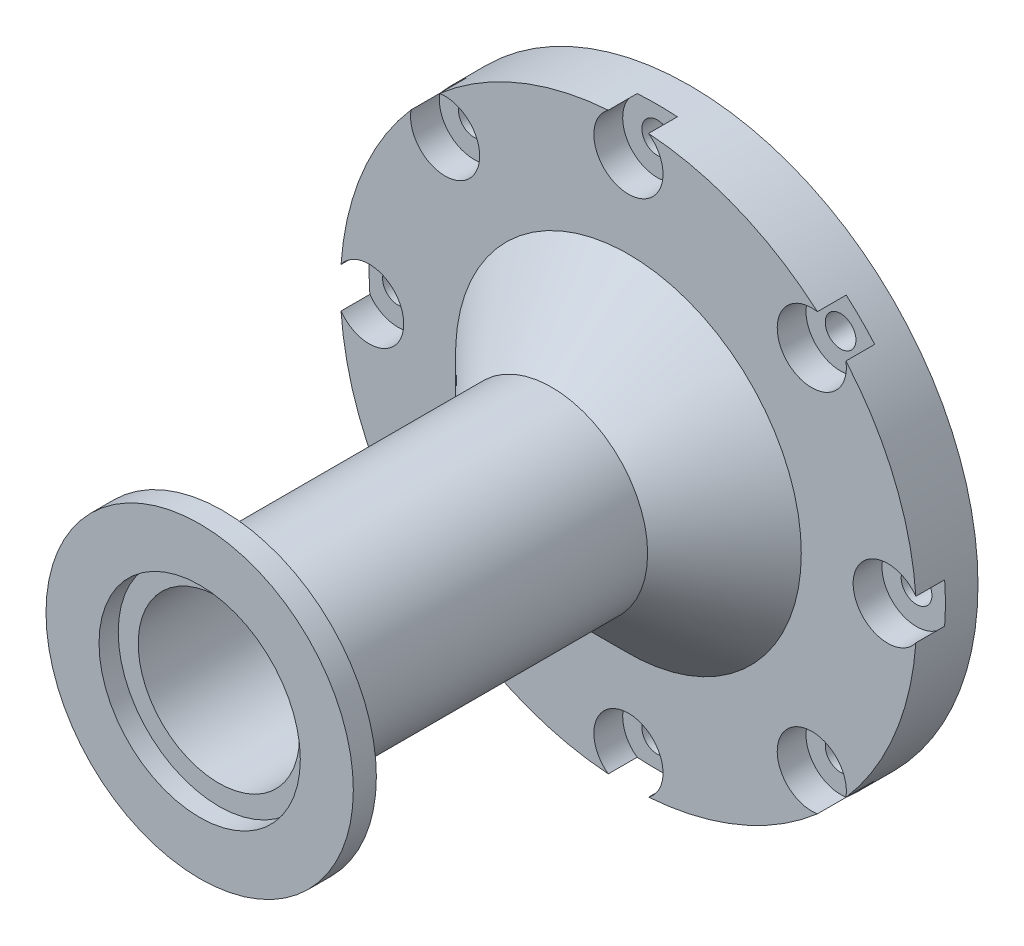
ISO-10303-21;
HEADER;
FILE_DESCRIPTION(('STEP AP214'),'2;1');
FILE_NAME('part.step','',(''),(''),'','','');
FILE_SCHEMA(('AUTOMOTIVE_DESIGN { 1 0 10303 214 1 1 1 1 }'));
ENDSEC;
DATA;
#1=APPLICATION_CONTEXT('core data for automotive mechanical design processes');
#2=APPLICATION_PROTOCOL_DEFINITION('international standard','automotive_design',2000,#1);
#3=PRODUCT_CONTEXT('',#1,'mechanical');
#4=PRODUCT('Part','Part','',(#3));
#5=PRODUCT_RELATED_PRODUCT_CATEGORY('part','',(#4));
#6=PRODUCT_DEFINITION_FORMATION('','',#4);
#7=PRODUCT_DEFINITION_CONTEXT('part definition',#1,'design');
#8=PRODUCT_DEFINITION('design','',#6,#7);
#9=PRODUCT_DEFINITION_SHAPE('','',#8);
#10=(LENGTH_UNIT() NAMED_UNIT(*) SI_UNIT(.MILLI.,.METRE.));
#11=(NAMED_UNIT(*) PLANE_ANGLE_UNIT() SI_UNIT($,.RADIAN.));
#12=(NAMED_UNIT(*) SI_UNIT($,.STERADIAN.) SOLID_ANGLE_UNIT());
#13=UNCERTAINTY_MEASURE_WITH_UNIT(LENGTH_MEASURE(1.E-05),#10,'distance_accuracy_value','');
#14=(GEOMETRIC_REPRESENTATION_CONTEXT(3) GLOBAL_UNCERTAINTY_ASSIGNED_CONTEXT((#13)) GLOBAL_UNIT_ASSIGNED_CONTEXT((#10,
#11,#12)) REPRESENTATION_CONTEXT('',''));
#15=CARTESIAN_POINT('',(0.,0.,0.));
#16=DIRECTION('',(0.,0.,1.));
#17=DIRECTION('',(1.,0.,0.));
#18=AXIS2_PLACEMENT_3D('',#15,#16,#17);
#19=CARTESIAN_POINT('',(-23.8648538650466,-23.8648538650456,7.99999999999999));
#20=DIRECTION('',(0.,0.,-1.));
#21=DIRECTION('',(-1.,0.,0.));
#22=AXIS2_PLACEMENT_3D('',#19,#20,#21);
#23=CYLINDRICAL_SURFACE('',#22,2.00000000000001);
#24=CARTESIAN_POINT('',(-23.8648538650466,-23.8648538650456,0.));
#25=DIRECTION('',(0.,0.,1.));
#26=DIRECTION('',(1.,0.,0.));
#27=AXIS2_PLACEMENT_3D('',#24,#25,#26);
#28=CIRCLE('',#27,2.00000000000001);
#29=CARTESIAN_POINT('',(-21.8648538650466,-23.8648538650456,0.));
#30=VERTEX_POINT('',#29);
#31=EDGE_CURVE('E993',#30,#30,#28,.T.);
#32=ORIENTED_EDGE('',*,*,#31,.F.);
#33=EDGE_LOOP('',(#32));
#34=FACE_BOUND('',#33,.T.);
#35=CARTESIAN_POINT('',(-23.8648538650466,-23.8648538650456,4.25));
#36=DIRECTION('',(0.,0.,1.));
#37=DIRECTION('',(1.,0.,0.));
#38=AXIS2_PLACEMENT_3D('',#35,#36,#37);
#39=CIRCLE('',#38,2.00000000000001);
#40=CARTESIAN_POINT('',(-21.8648538650466,-23.8648538650456,4.25));
#41=VERTEX_POINT('',#40);
#42=EDGE_CURVE('E871',#41,#41,#39,.T.);
#43=ORIENTED_EDGE('',*,*,#42,.T.);
#44=EDGE_LOOP('',(#43));
#45=FACE_BOUND('',#44,.T.);
#46=ADVANCED_FACE('F566',(#34,#45),#23,.F.);
#47=CARTESIAN_POINT('',(-7.23379689482329E-13,-33.7500000000001,7.99999999999999));
#48=DIRECTION('',(0.,0.,-1.));
#49=DIRECTION('',(-1.,0.,0.));
#50=AXIS2_PLACEMENT_3D('',#47,#48,#49);
#51=CYLINDRICAL_SURFACE('',#50,2.00000000000001);
#52=CARTESIAN_POINT('',(-7.23379689482329E-13,-33.7500000000001,0.));
#53=DIRECTION('',(0.,0.,1.));
#54=DIRECTION('',(1.,0.,0.));
#55=AXIS2_PLACEMENT_3D('',#52,#53,#54);
#56=CIRCLE('',#55,2.00000000000001);
#57=CARTESIAN_POINT('',(1.99999999999928,-33.7500000000001,0.));
#58=VERTEX_POINT('',#57);
#59=EDGE_CURVE('E989',#58,#58,#56,.T.);
#60=ORIENTED_EDGE('',*,*,#59,.F.);
#61=EDGE_LOOP('',(#60));
#62=FACE_BOUND('',#61,.T.);
#63=CARTESIAN_POINT('',(-7.23379689482329E-13,-33.7500000000001,4.24999999999999));
#64=DIRECTION('',(0.,0.,1.));
#65=DIRECTION('',(1.,0.,0.));
#66=AXIS2_PLACEMENT_3D('',#63,#64,#65);
#67=CIRCLE('',#66,2.00000000000001);
#68=CARTESIAN_POINT('',(1.99999999999928,-33.7500000000001,4.24999999999999));
#69=VERTEX_POINT('',#68);
#70=EDGE_CURVE('E859',#69,#69,#67,.T.);
#71=ORIENTED_EDGE('',*,*,#70,.T.);
#72=EDGE_LOOP('',(#71));
#73=FACE_BOUND('',#72,.T.);
#74=ADVANCED_FACE('F1045',(#62,#73),#51,.F.);
#75=CARTESIAN_POINT('',(23.8648538650455,-23.8648538650465,7.99999999999999));
#76=DIRECTION('',(0.,0.,-1.));
#77=DIRECTION('',(-1.,0.,0.));
#78=AXIS2_PLACEMENT_3D('',#75,#76,#77);
#79=CYLINDRICAL_SURFACE('',#78,2.);
#80=CARTESIAN_POINT('',(23.8648538650455,-23.8648538650465,0.));
#81=DIRECTION('',(0.,0.,1.));
#82=DIRECTION('',(1.,0.,0.));
#83=AXIS2_PLACEMENT_3D('',#80,#81,#82);
#84=CIRCLE('',#83,2.);
#85=CARTESIAN_POINT('',(25.8648538650455,-23.8648538650465,0.));
#86=VERTEX_POINT('',#85);
#87=EDGE_CURVE('E985',#86,#86,#84,.T.);
#88=ORIENTED_EDGE('',*,*,#87,.F.);
#89=EDGE_LOOP('',(#88));
#90=FACE_BOUND('',#89,.T.);
#91=CARTESIAN_POINT('',(23.8648538650455,-23.8648538650465,4.25));
#92=DIRECTION('',(0.,0.,1.));
#93=DIRECTION('',(1.,0.,0.));
#94=AXIS2_PLACEMENT_3D('',#91,#92,#93);
#95=CIRCLE('',#94,2.);
#96=CARTESIAN_POINT('',(25.8648538650455,-23.8648538650465,4.25));
#97=VERTEX_POINT('',#96);
#98=EDGE_CURVE('E845',#97,#97,#95,.T.);
#99=ORIENTED_EDGE('',*,*,#98,.T.);
#100=EDGE_LOOP('',(#99));
#101=FACE_BOUND('',#100,.T.);
#102=ADVANCED_FACE('F1050',(#90,#101),#79,.F.);
#103=CARTESIAN_POINT('',(33.75,0.,8.00000000000001));
#104=DIRECTION('',(0.,0.,-1.));
#105=DIRECTION('',(-1.,0.,0.));
#106=AXIS2_PLACEMENT_3D('',#103,#104,#105);
#107=CYLINDRICAL_SURFACE('',#106,2.);
#108=CARTESIAN_POINT('',(33.75,0.,0.));
#109=DIRECTION('',(0.,0.,1.));
#110=DIRECTION('',(1.,0.,0.));
#111=AXIS2_PLACEMENT_3D('',#108,#109,#110);
#112=CIRCLE('',#111,2.);
#113=CARTESIAN_POINT('',(35.75,0.,0.));
#114=VERTEX_POINT('',#113);
#115=EDGE_CURVE('E981',#114,#114,#112,.T.);
#116=ORIENTED_EDGE('',*,*,#115,.F.);
#117=EDGE_LOOP('',(#116));
#118=FACE_BOUND('',#117,.T.);
#119=CARTESIAN_POINT('',(33.75,0.,4.25));
#120=DIRECTION('',(0.,0.,1.));
#121=DIRECTION('',(1.,0.,0.));
#122=AXIS2_PLACEMENT_3D('',#119,#120,#121);
#123=CIRCLE('',#122,2.);
#124=CARTESIAN_POINT('',(35.75,0.,4.25));
#125=VERTEX_POINT('',#124);
#126=EDGE_CURVE('E831',#125,#125,#123,.T.);
#127=ORIENTED_EDGE('',*,*,#126,.T.);
#128=EDGE_LOOP('',(#127));
#129=FACE_BOUND('',#128,.T.);
#130=ADVANCED_FACE('F1091',(#118,#129),#107,.F.);
#131=CARTESIAN_POINT('',(23.8648538650463,23.8648538650457,8.00000000000001));
#132=DIRECTION('',(0.,0.,-1.));
#133=DIRECTION('',(-1.,0.,0.));
#134=AXIS2_PLACEMENT_3D('',#131,#132,#133);
#135=CYLINDRICAL_SURFACE('',#134,2.);
#136=CARTESIAN_POINT('',(23.8648538650463,23.8648538650457,0.));
#137=DIRECTION('',(0.,0.,1.));
#138=DIRECTION('',(1.,0.,0.));
#139=AXIS2_PLACEMENT_3D('',#136,#137,#138);
#140=CIRCLE('',#139,2.);
#141=CARTESIAN_POINT('',(25.8648538650463,23.8648538650457,0.));
#142=VERTEX_POINT('',#141);
#143=EDGE_CURVE('E974',#142,#142,#140,.T.);
#144=ORIENTED_EDGE('',*,*,#143,.F.);
#145=EDGE_LOOP('',(#144));
#146=FACE_BOUND('',#145,.T.);
#147=CARTESIAN_POINT('',(23.8648538650463,23.8648538650457,4.25));
#148=DIRECTION('',(0.,0.,1.));
#149=DIRECTION('',(1.,0.,0.));
#150=AXIS2_PLACEMENT_3D('',#147,#148,#149);
#151=CIRCLE('',#150,2.);
#152=CARTESIAN_POINT('',(25.8648538650463,23.8648538650457,4.25));
#153=VERTEX_POINT('',#152);
#154=EDGE_CURVE('E817',#153,#153,#151,.T.);
#155=ORIENTED_EDGE('',*,*,#154,.T.);
#156=EDGE_LOOP('',(#155));
#157=FACE_BOUND('',#156,.T.);
#158=ADVANCED_FACE('F1063',(#146,#157),#135,.F.);
#159=CARTESIAN_POINT('',(3.48471251854221E-13,33.75,8.00000000000001));
#160=DIRECTION('',(0.,0.,-1.));
#161=DIRECTION('',(-1.,0.,0.));
#162=AXIS2_PLACEMENT_3D('',#159,#160,#161);
#163=CYLINDRICAL_SURFACE('',#162,2.);
#164=CARTESIAN_POINT('',(3.48471251854221E-13,33.75,0.));
#165=DIRECTION('',(0.,0.,1.));
#166=DIRECTION('',(1.,0.,0.));
#167=AXIS2_PLACEMENT_3D('',#164,#165,#166);
#168=CIRCLE('',#167,2.);
#169=CARTESIAN_POINT('',(2.00000000000035,33.75,0.));
#170=VERTEX_POINT('',#169);
#171=EDGE_CURVE('E759',#170,#170,#168,.T.);
#172=ORIENTED_EDGE('',*,*,#171,.F.);
#173=EDGE_LOOP('',(#172));
#174=FACE_BOUND('',#173,.T.);
#175=CARTESIAN_POINT('',(3.48471251854221E-13,33.75,4.25));
#176=DIRECTION('',(0.,0.,1.));
#177=DIRECTION('',(1.,0.,0.));
#178=AXIS2_PLACEMENT_3D('',#175,#176,#177);
#179=CIRCLE('',#178,2.);
#180=CARTESIAN_POINT('',(2.00000000000035,33.75,4.25));
#181=VERTEX_POINT('',#180);
#182=EDGE_CURVE('E803',#181,#181,#179,.T.);
#183=ORIENTED_EDGE('',*,*,#182,.T.);
#184=EDGE_LOOP('',(#183));
#185=FACE_BOUND('',#184,.T.);
#186=ADVANCED_FACE('F1013',(#174,#185),#163,.F.);
#187=CARTESIAN_POINT('',(-23.8648538650459,23.8648538650462,8.00000000000001));
#188=DIRECTION('',(0.,0.,-1.));
#189=DIRECTION('',(-1.,0.,0.));
#190=AXIS2_PLACEMENT_3D('',#187,#188,#189);
#191=CYLINDRICAL_SURFACE('',#190,2.00000000000001);
#192=CARTESIAN_POINT('',(-23.8648538650459,23.8648538650462,0.));
#193=DIRECTION('',(0.,0.,1.));
#194=DIRECTION('',(1.,0.,0.));
#195=AXIS2_PLACEMENT_3D('',#192,#193,#194);
#196=CIRCLE('',#195,2.00000000000001);
#197=CARTESIAN_POINT('',(-21.8648538650459,23.8648538650462,0.));
#198=VERTEX_POINT('',#197);
#199=EDGE_CURVE('E764',#198,#198,#196,.T.);
#200=ORIENTED_EDGE('',*,*,#199,.F.);
#201=EDGE_LOOP('',(#200));
#202=FACE_BOUND('',#201,.T.);
#203=CARTESIAN_POINT('',(-23.8648538650459,23.8648538650462,4.25));
#204=DIRECTION('',(0.,0.,1.));
#205=DIRECTION('',(1.,0.,0.));
#206=AXIS2_PLACEMENT_3D('',#203,#204,#205);
#207=CIRCLE('',#206,2.00000000000001);
#208=CARTESIAN_POINT('',(-21.8648538650459,23.8648538650462,4.25));
#209=VERTEX_POINT('',#208);
#210=EDGE_CURVE('E789',#209,#209,#207,.T.);
#211=ORIENTED_EDGE('',*,*,#210,.T.);
#212=EDGE_LOOP('',(#211));
#213=FACE_BOUND('',#212,.T.);
#214=ADVANCED_FACE('F1009',(#202,#213),#191,.F.);
#215=CARTESIAN_POINT('',(-33.7500000000002,1.85615411929518E-13,8.00000000000001));
#216=DIRECTION('',(0.,0.,-1.));
#217=DIRECTION('',(-1.,0.,0.));
#218=AXIS2_PLACEMENT_3D('',#215,#216,#217);
#219=CYLINDRICAL_SURFACE('',#218,2.00000000000001);
#220=CARTESIAN_POINT('',(-33.7500000000002,1.85615411929518E-13,0.));
#221=DIRECTION('',(0.,0.,1.));
#222=DIRECTION('',(1.,0.,0.));
#223=AXIS2_PLACEMENT_3D('',#220,#221,#222);
#224=CIRCLE('',#223,2.00000000000001);
#225=CARTESIAN_POINT('',(-31.7500000000002,1.85615411929518E-13,0.));
#226=VERTEX_POINT('',#225);
#227=EDGE_CURVE('E997',#226,#226,#224,.T.);
#228=ORIENTED_EDGE('',*,*,#227,.F.);
#229=EDGE_LOOP('',(#228));
#230=FACE_BOUND('',#229,.T.);
#231=CARTESIAN_POINT('',(-33.7500000000002,1.85615411929518E-13,4.25));
#232=DIRECTION('',(0.,0.,1.));
#233=DIRECTION('',(1.,0.,0.));
#234=AXIS2_PLACEMENT_3D('',#231,#232,#233);
#235=CIRCLE('',#234,2.00000000000001);
#236=CARTESIAN_POINT('',(-31.7500000000002,1.85615411929518E-13,4.25));
#237=VERTEX_POINT('',#236);
#238=EDGE_CURVE('E776',#237,#237,#235,.T.);
#239=ORIENTED_EDGE('',*,*,#238,.T.);
#240=EDGE_LOOP('',(#239));
#241=FACE_BOUND('',#240,.T.);
#242=ADVANCED_FACE('F1012',(#230,#241),#219,.F.);
#243=CARTESIAN_POINT('',(0.,0.,58.8));
#244=DIRECTION('',(0.,0.,-1.));
#245=DIRECTION('',(-1.,0.,0.));
#246=AXIS2_PLACEMENT_3D('',#243,#244,#245);
#247=CYLINDRICAL_SURFACE('',#246,10.5);
#248=CARTESIAN_POINT('',(0.,0.,0.));
#249=DIRECTION('',(0.,0.,1.));
#250=DIRECTION('',(1.,0.,0.));
#251=AXIS2_PLACEMENT_3D('',#248,#249,#250);
#252=CIRCLE('',#251,10.5);
#253=CARTESIAN_POINT('',(10.5,0.,0.));
#254=VERTEX_POINT('',#253);
#255=EDGE_CURVE('E949',#254,#254,#252,.T.);
#256=ORIENTED_EDGE('',*,*,#255,.F.);
#257=EDGE_LOOP('',(#256));
#258=FACE_BOUND('',#257,.T.);
#259=CARTESIAN_POINT('',(0.,0.,61.31));
#260=DIRECTION('',(0.,0.,1.));
#261=DIRECTION('',(1.,0.,0.));
#262=AXIS2_PLACEMENT_3D('',#259,#260,#261);
#263=CIRCLE('',#262,10.5);
#264=CARTESIAN_POINT('',(10.5,0.,61.31));
#265=VERTEX_POINT('',#264);
#266=EDGE_CURVE('E766',#265,#265,#263,.T.);
#267=ORIENTED_EDGE('',*,*,#266,.T.);
#268=EDGE_LOOP('',(#267));
#269=FACE_BOUND('',#268,.T.);
#270=ADVANCED_FACE('F1058',(#258,#269),#247,.F.);
#271=CARTESIAN_POINT('',(0.,0.,8.00000000000001));
#272=DIRECTION('',(0.,0.,1.));
#273=DIRECTION('',(1.,0.,0.));
#274=AXIS2_PLACEMENT_3D('',#271,#272,#273);
#275=PLANE('',#274);
#276=CARTESIAN_POINT('',(-23.8648538650465,-23.8648538650457,7.99999999999999));
#277=DIRECTION('',(0.,0.,1.));
#278=DIRECTION('',(1.,0.,0.));
#279=AXIS2_PLACEMENT_3D('',#276,#277,#278);
#280=CIRCLE('',#279,4.50000000000002);
#281=CARTESIAN_POINT('',(-24.598769927853,-28.3046024179206,7.99999999999999));
#282=VERTEX_POINT('',#281);
#283=CARTESIAN_POINT('',(-28.3046024179215,-24.598769927852,7.99999999999999));
#284=VERTEX_POINT('',#283);
#285=EDGE_CURVE('E715',#282,#284,#280,.T.);
#286=ORIENTED_EDGE('',*,*,#285,.F.);
#287=CARTESIAN_POINT('',(0.,0.,8.00000000000001));
#288=DIRECTION('',(0.,0.,1.));
#289=DIRECTION('',(1.,0.,0.));
#290=AXIS2_PLACEMENT_3D('',#287,#288,#289);
#291=CIRCLE('',#290,37.5);
#292=CARTESIAN_POINT('',(-2.62041928366741,-37.4083333333334,7.99999999999999));
#293=VERTEX_POINT('',#292);
#294=EDGE_CURVE('E737',#282,#293,#291,.T.);
#295=ORIENTED_EDGE('',*,*,#294,.T.);
#296=CARTESIAN_POINT('',(2.97693625175233E-13,-33.7499999999997,7.99999999999999));
#297=DIRECTION('',(0.,0.,1.));
#298=DIRECTION('',(1.,0.,0.));
#299=AXIS2_PLACEMENT_3D('',#296,#297,#298);
#300=CIRCLE('',#299,4.4999999999998);
#301=CARTESIAN_POINT('',(2.62041928366806,-37.4083333333334,7.99999999999999));
#302=VERTEX_POINT('',#301);
#303=EDGE_CURVE('E879',#302,#293,#300,.T.);
#304=ORIENTED_EDGE('',*,*,#303,.F.);
#305=CARTESIAN_POINT('',(24.5987699278534,-28.3046024179202,7.99999999999999));
#306=VERTEX_POINT('',#305);
#307=EDGE_CURVE('E746',#302,#306,#291,.T.);
#308=ORIENTED_EDGE('',*,*,#307,.T.);
#309=CARTESIAN_POINT('',(23.8648538650463,-23.8648538650454,7.99999999999999));
#310=DIRECTION('',(0.,0.,1.));
#311=DIRECTION('',(1.,0.,0.));
#312=AXIS2_PLACEMENT_3D('',#309,#310,#311);
#313=CIRCLE('',#312,4.50000000000001);
#314=CARTESIAN_POINT('',(28.3046024179211,-24.5987699278524,7.99999999999999));
#315=VERTEX_POINT('',#314);
#316=EDGE_CURVE('E893',#315,#306,#313,.T.);
#317=ORIENTED_EDGE('',*,*,#316,.F.);
#318=CARTESIAN_POINT('',(37.4083333333333,-2.62041928366869,8.00000000000001));
#319=VERTEX_POINT('',#318);
#320=EDGE_CURVE('E1114',#315,#319,#291,.T.);
#321=ORIENTED_EDGE('',*,*,#320,.T.);
#322=CARTESIAN_POINT('',(33.7500000000002,7.72736296385739E-13,8.00000000000001));
#323=DIRECTION('',(0.,0.,1.));
#324=DIRECTION('',(1.,0.,0.));
#325=AXIS2_PLACEMENT_3D('',#322,#323,#324);
#326=CIRCLE('',#325,4.50000000000036);
#327=CARTESIAN_POINT('',(37.4083333333332,2.6204192836704,8.00000000000001));
#328=VERTEX_POINT('',#327);
#329=EDGE_CURVE('E901',#328,#319,#326,.T.);
#330=ORIENTED_EDGE('',*,*,#329,.F.);
#331=CARTESIAN_POINT('',(28.3046024179217,24.5987699278518,8.00000000000001));
#332=VERTEX_POINT('',#331);
#333=EDGE_CURVE('E1119',#328,#332,#291,.T.);
#334=ORIENTED_EDGE('',*,*,#333,.T.);
#335=CARTESIAN_POINT('',(23.8648538650459,23.8648538650468,8.00000000000001));
#336=DIRECTION('',(0.,0.,1.));
#337=DIRECTION('',(1.,0.,0.));
#338=AXIS2_PLACEMENT_3D('',#335,#336,#337);
#339=CIRCLE('',#338,4.50000000000063);
#340=CARTESIAN_POINT('',(24.5987699278507,28.3046024179226,8.00000000000001));
#341=VERTEX_POINT('',#340);
#342=EDGE_CURVE('E909',#341,#332,#339,.T.);
#343=ORIENTED_EDGE('',*,*,#342,.F.);
#344=CARTESIAN_POINT('',(2.62041928366921,37.4083333333333,8.00000000000001));
#345=VERTEX_POINT('',#344);
#346=EDGE_CURVE('E757',#341,#345,#291,.T.);
#347=ORIENTED_EDGE('',*,*,#346,.T.);
#348=CARTESIAN_POINT('',(3.03452907115475E-13,33.7500000000002,8.00000000000001));
#349=DIRECTION('',(0.,0.,1.));
#350=DIRECTION('',(1.,0.,0.));
#351=AXIS2_PLACEMENT_3D('',#348,#349,#350);
#352=CIRCLE('',#351,4.50000000000001);
#353=CARTESIAN_POINT('',(-2.62041928366854,37.4083333333333,8.00000000000001));
#354=VERTEX_POINT('',#353);
#355=EDGE_CURVE('E917',#354,#345,#352,.T.);
#356=ORIENTED_EDGE('',*,*,#355,.F.);
#357=CARTESIAN_POINT('',(-24.5987699278523,28.3046024179212,8.00000000000001));
#358=VERTEX_POINT('',#357);
#359=EDGE_CURVE('E750',#354,#358,#291,.T.);
#360=ORIENTED_EDGE('',*,*,#359,.T.);
#361=CARTESIAN_POINT('',(-23.8648538650459,23.8648538650463,8.00000000000001));
#362=DIRECTION('',(0.,0.,1.));
#363=DIRECTION('',(1.,0.,0.));
#364=AXIS2_PLACEMENT_3D('',#361,#362,#363);
#365=CIRCLE('',#364,4.50000000000001);
#366=CARTESIAN_POINT('',(-28.3046024179208,24.5987699278527,8.00000000000001));
#367=VERTEX_POINT('',#366);
#368=EDGE_CURVE('E925',#367,#358,#365,.T.);
#369=ORIENTED_EDGE('',*,*,#368,.F.);
#370=CARTESIAN_POINT('',(-37.4083333333333,2.62041928366908,8.00000000000001));
#371=VERTEX_POINT('',#370);
#372=EDGE_CURVE('E739',#367,#371,#291,.T.);
#373=ORIENTED_EDGE('',*,*,#372,.T.);
#374=CARTESIAN_POINT('',(-33.7500000000002,1.85615411929518E-13,8.00000000000001));
#375=DIRECTION('',(0.,0.,1.));
#376=DIRECTION('',(1.,0.,0.));
#377=AXIS2_PLACEMENT_3D('',#374,#375,#376);
#378=CIRCLE('',#377,4.50000000000001);
#379=CARTESIAN_POINT('',(-37.4083333333333,-2.62041928366867,8.00000000000001));
#380=VERTEX_POINT('',#379);
#381=EDGE_CURVE('E734',#380,#371,#378,.T.);
#382=ORIENTED_EDGE('',*,*,#381,.F.);
#383=EDGE_CURVE('E728',#380,#284,#291,.T.);
#384=ORIENTED_EDGE('',*,*,#383,.T.);
#385=EDGE_LOOP('',(#286,#295,#304,#308,#317,#321,#330,#334,#343,#347,#356,#360,#369,#373,#382,#384));
#386=FACE_BOUND('',#385,.T.);
#387=CARTESIAN_POINT('',(0.,0.,8.00000000000001));
#388=DIRECTION('',(0.,0.,1.));
#389=DIRECTION('',(1.,0.,0.));
#390=AXIS2_PLACEMENT_3D('',#387,#388,#389);
#391=CIRCLE('',#390,22.5);
#392=CARTESIAN_POINT('',(22.5,0.,8.00000000000001));
#393=VERTEX_POINT('',#392);
#394=EDGE_CURVE('E744',#393,#393,#391,.F.);
#395=ORIENTED_EDGE('',*,*,#394,.T.);
#396=EDGE_LOOP('',(#395));
#397=FACE_BOUND('',#396,.T.);
#398=ADVANCED_FACE('F731',(#386,#397),#275,.T.);
#399=CARTESIAN_POINT('',(0.,0.,0.));
#400=DIRECTION('',(0.,0.,1.));
#401=DIRECTION('',(1.,0.,0.));
#402=AXIS2_PLACEMENT_3D('',#399,#400,#401);
#403=PLANE('',#402);
#404=ORIENTED_EDGE('',*,*,#115,.T.);
#405=EDGE_LOOP('',(#404));
#406=FACE_BOUND('',#405,.T.);
#407=ORIENTED_EDGE('',*,*,#59,.T.);
#408=EDGE_LOOP('',(#407));
#409=FACE_BOUND('',#408,.T.);
#410=ORIENTED_EDGE('',*,*,#227,.T.);
#411=EDGE_LOOP('',(#410));
#412=FACE_BOUND('',#411,.T.);
#413=ORIENTED_EDGE('',*,*,#171,.T.);
#414=EDGE_LOOP('',(#413));
#415=FACE_BOUND('',#414,.T.);
#416=CARTESIAN_POINT('',(0.,0.,0.));
#417=DIRECTION('',(0.,0.,1.));
#418=DIRECTION('',(1.,0.,0.));
#419=AXIS2_PLACEMENT_3D('',#416,#417,#418);
#420=CIRCLE('',#419,37.5);
#421=CARTESIAN_POINT('',(37.5,0.,0.));
#422=VERTEX_POINT('',#421);
#423=EDGE_CURVE('E751',#422,#422,#420,.T.);
#424=ORIENTED_EDGE('',*,*,#423,.F.);
#425=EDGE_LOOP('',(#424));
#426=FACE_BOUND('',#425,.T.);
#427=ORIENTED_EDGE('',*,*,#199,.T.);
#428=EDGE_LOOP('',(#427));
#429=FACE_BOUND('',#428,.T.);
#430=ORIENTED_EDGE('',*,*,#31,.T.);
#431=EDGE_LOOP('',(#430));
#432=FACE_BOUND('',#431,.T.);
#433=ORIENTED_EDGE('',*,*,#87,.T.);
#434=EDGE_LOOP('',(#433));
#435=FACE_BOUND('',#434,.T.);
#436=ORIENTED_EDGE('',*,*,#143,.T.);
#437=EDGE_LOOP('',(#436));
#438=FACE_BOUND('',#437,.T.);
#439=CARTESIAN_POINT('',(0.,0.,0.));
#440=DIRECTION('',(0.,0.,1.));
#441=DIRECTION('',(1.,0.,0.));
#442=AXIS2_PLACEMENT_3D('',#439,#440,#441);
#443=CIRCLE('',#442,20.71);
#444=CARTESIAN_POINT('',(20.71,0.,0.));
#445=VERTEX_POINT('',#444);
#446=EDGE_CURVE('E966',#445,#445,#443,.T.);
#447=ORIENTED_EDGE('',*,*,#446,.T.);
#448=EDGE_LOOP('',(#447));
#449=FACE_BOUND('',#448,.T.);
#450=ADVANCED_FACE('F1006',(#406,#409,#412,#415,#426,#429,#432,#435,#438,#449),#403,.F.);
#451=ORIENTED_EDGE('',*,*,#255,.T.);
#452=EDGE_LOOP('',(#451));
#453=FACE_BOUND('',#452,.T.);
#454=CARTESIAN_POINT('',(0.,0.,0.));
#455=DIRECTION('',(0.,0.,1.));
#456=DIRECTION('',(1.,0.,0.));
#457=AXIS2_PLACEMENT_3D('',#454,#455,#456);
#458=CIRCLE('',#457,19.21);
#459=CARTESIAN_POINT('',(19.21,0.,0.));
#460=VERTEX_POINT('',#459);
#461=EDGE_CURVE('E961',#460,#460,#458,.T.);
#462=ORIENTED_EDGE('',*,*,#461,.F.);
#463=EDGE_LOOP('',(#462));
#464=FACE_BOUND('',#463,.T.);
#465=ADVANCED_FACE('F1067',(#453,#464),#403,.F.);
#466=CARTESIAN_POINT('',(0.,0.,8.00000000000001));
#467=DIRECTION('',(0.,0.,-1.));
#468=DIRECTION('',(-1.,0.,0.));
#469=AXIS2_PLACEMENT_3D('',#466,#467,#468);
#470=CYLINDRICAL_SURFACE('',#469,37.5);
#471=CARTESIAN_POINT('',(0.,0.,4.25));
#472=DIRECTION('',(0.,0.,1.));
#473=DIRECTION('',(1.,0.,0.));
#474=AXIS2_PLACEMENT_3D('',#471,#472,#473);
#475=CIRCLE('',#474,37.5);
#476=CARTESIAN_POINT('',(-28.3046024179215,-24.598769927852,4.25));
#477=VERTEX_POINT('',#476);
#478=CARTESIAN_POINT('',(-24.598769927853,-28.3046024179206,4.25));
#479=VERTEX_POINT('',#478);
#480=EDGE_CURVE('E729',#477,#479,#475,.T.);
#481=ORIENTED_EDGE('',*,*,#480,.F.);
#482=DIRECTION('',(0.,0.,1.));
#483=VECTOR('',#482,1.);
#484=CARTESIAN_POINT('',(-28.3046024179215,-24.598769927852,6.12499999999999));
#485=LINE('',#484,#483);
#486=EDGE_CURVE('E14',#477,#284,#485,.T.);
#487=ORIENTED_EDGE('',*,*,#486,.T.);
#488=ORIENTED_EDGE('',*,*,#383,.F.);
#489=DIRECTION('',(0.,0.,1.));
#490=VECTOR('',#489,1.);
#491=CARTESIAN_POINT('',(-37.4083333333333,-2.62041928366866,6.12500000000001));
#492=LINE('',#491,#490);
#493=CARTESIAN_POINT('',(-37.4083333333333,-2.62041928366867,4.25));
#494=VERTEX_POINT('',#493);
#495=EDGE_CURVE('E775',#380,#494,#492,.F.);
#496=ORIENTED_EDGE('',*,*,#495,.T.);
#497=CARTESIAN_POINT('',(0.,0.,4.25));
#498=DIRECTION('',(0.,0.,1.));
#499=DIRECTION('',(1.,0.,0.));
#500=AXIS2_PLACEMENT_3D('',#497,#498,#499);
#501=CIRCLE('',#500,37.5);
#502=CARTESIAN_POINT('',(-37.4083333333333,2.62041928366908,4.25));
#503=VERTEX_POINT('',#502);
#504=EDGE_CURVE('E780',#503,#494,#501,.T.);
#505=ORIENTED_EDGE('',*,*,#504,.F.);
#506=DIRECTION('',(0.,0.,1.));
#507=VECTOR('',#506,1.);
#508=CARTESIAN_POINT('',(-37.4083333333333,2.62041928366907,6.12500000000001));
#509=LINE('',#508,#507);
#510=EDGE_CURVE('E784',#503,#371,#509,.T.);
#511=ORIENTED_EDGE('',*,*,#510,.T.);
#512=ORIENTED_EDGE('',*,*,#372,.F.);
#513=DIRECTION('',(0.,0.,1.));
#514=VECTOR('',#513,1.);
#515=CARTESIAN_POINT('',(-28.3046024179208,24.5987699278527,6.12500000000001));
#516=LINE('',#515,#514);
#517=CARTESIAN_POINT('',(-28.3046024179208,24.5987699278527,4.25));
#518=VERTEX_POINT('',#517);
#519=EDGE_CURVE('E788',#367,#518,#516,.F.);
#520=ORIENTED_EDGE('',*,*,#519,.T.);
#521=CARTESIAN_POINT('',(0.,0.,4.25));
#522=DIRECTION('',(0.,0.,1.));
#523=DIRECTION('',(1.,0.,0.));
#524=AXIS2_PLACEMENT_3D('',#521,#522,#523);
#525=CIRCLE('',#524,37.5);
#526=CARTESIAN_POINT('',(-24.5987699278523,28.3046024179212,4.25));
#527=VERTEX_POINT('',#526);
#528=EDGE_CURVE('E793',#527,#518,#525,.T.);
#529=ORIENTED_EDGE('',*,*,#528,.F.);
#530=DIRECTION('',(0.,0.,1.));
#531=VECTOR('',#530,1.);
#532=CARTESIAN_POINT('',(-24.5987699278523,28.3046024179212,6.12500000000001));
#533=LINE('',#532,#531);
#534=EDGE_CURVE('E798',#527,#358,#533,.T.);
#535=ORIENTED_EDGE('',*,*,#534,.T.);
#536=ORIENTED_EDGE('',*,*,#359,.F.);
#537=DIRECTION('',(0.,0.,1.));
#538=VECTOR('',#537,1.);
#539=CARTESIAN_POINT('',(-2.62041928366853,37.4083333333334,6.12500000000001));
#540=LINE('',#539,#538);
#541=CARTESIAN_POINT('',(-2.62041928366854,37.4083333333333,4.25));
#542=VERTEX_POINT('',#541);
#543=EDGE_CURVE('E802',#354,#542,#540,.F.);
#544=ORIENTED_EDGE('',*,*,#543,.T.);
#545=CARTESIAN_POINT('',(0.,0.,4.25));
#546=DIRECTION('',(0.,0.,1.));
#547=DIRECTION('',(1.,0.,0.));
#548=AXIS2_PLACEMENT_3D('',#545,#546,#547);
#549=CIRCLE('',#548,37.5);
#550=CARTESIAN_POINT('',(2.62041928366921,37.4083333333333,4.25));
#551=VERTEX_POINT('',#550);
#552=EDGE_CURVE('E807',#551,#542,#549,.T.);
#553=ORIENTED_EDGE('',*,*,#552,.F.);
#554=DIRECTION('',(0.,0.,1.));
#555=VECTOR('',#554,1.);
#556=CARTESIAN_POINT('',(2.6204192836692,37.4083333333333,6.12500000000001));
#557=LINE('',#556,#555);
#558=EDGE_CURVE('E812',#551,#345,#557,.T.);
#559=ORIENTED_EDGE('',*,*,#558,.T.);
#560=ORIENTED_EDGE('',*,*,#346,.F.);
#561=DIRECTION('',(0.,0.,1.));
#562=VECTOR('',#561,1.);
#563=CARTESIAN_POINT('',(24.5987699278507,28.3046024179226,6.12500000000001));
#564=LINE('',#563,#562);
#565=CARTESIAN_POINT('',(24.5987699278507,28.3046024179226,4.25));
#566=VERTEX_POINT('',#565);
#567=EDGE_CURVE('E816',#341,#566,#564,.F.);
#568=ORIENTED_EDGE('',*,*,#567,.T.);
#569=CARTESIAN_POINT('',(0.,0.,4.25));
#570=DIRECTION('',(0.,0.,1.));
#571=DIRECTION('',(1.,0.,0.));
#572=AXIS2_PLACEMENT_3D('',#569,#570,#571);
#573=CIRCLE('',#572,37.5);
#574=CARTESIAN_POINT('',(28.3046024179217,24.5987699278518,4.25));
#575=VERTEX_POINT('',#574);
#576=EDGE_CURVE('E821',#575,#566,#573,.T.);
#577=ORIENTED_EDGE('',*,*,#576,.F.);
#578=DIRECTION('',(0.,0.,1.));
#579=VECTOR('',#578,1.);
#580=CARTESIAN_POINT('',(28.3046024179217,24.5987699278518,6.12500000000001));
#581=LINE('',#580,#579);
#582=EDGE_CURVE('E826',#575,#332,#581,.T.);
#583=ORIENTED_EDGE('',*,*,#582,.T.);
#584=ORIENTED_EDGE('',*,*,#333,.F.);
#585=DIRECTION('',(0.,0.,1.));
#586=VECTOR('',#585,1.);
#587=CARTESIAN_POINT('',(37.4083333333332,2.62041928367041,6.12500000000001));
#588=LINE('',#587,#586);
#589=CARTESIAN_POINT('',(37.4083333333332,2.6204192836704,4.25));
#590=VERTEX_POINT('',#589);
#591=EDGE_CURVE('E830',#328,#590,#588,.F.);
#592=ORIENTED_EDGE('',*,*,#591,.T.);
#593=CARTESIAN_POINT('',(0.,0.,4.25));
#594=DIRECTION('',(0.,0.,1.));
#595=DIRECTION('',(1.,0.,0.));
#596=AXIS2_PLACEMENT_3D('',#593,#594,#595);
#597=CIRCLE('',#596,37.5);
#598=CARTESIAN_POINT('',(37.4083333333333,-2.62041928366869,4.25));
#599=VERTEX_POINT('',#598);
#600=EDGE_CURVE('E835',#599,#590,#597,.T.);
#601=ORIENTED_EDGE('',*,*,#600,.F.);
#602=DIRECTION('',(0.,0.,1.));
#603=VECTOR('',#602,1.);
#604=CARTESIAN_POINT('',(37.4083333333333,-2.6204192836687,6.12500000000001));
#605=LINE('',#604,#603);
#606=EDGE_CURVE('E840',#599,#319,#605,.T.);
#607=ORIENTED_EDGE('',*,*,#606,.T.);
#608=ORIENTED_EDGE('',*,*,#320,.F.);
#609=DIRECTION('',(0.,0.,1.));
#610=VECTOR('',#609,1.);
#611=CARTESIAN_POINT('',(28.3046024179211,-24.5987699278524,6.12499999999999));
#612=LINE('',#611,#610);
#613=CARTESIAN_POINT('',(28.3046024179211,-24.5987699278524,4.25));
#614=VERTEX_POINT('',#613);
#615=EDGE_CURVE('E844',#315,#614,#612,.F.);
#616=ORIENTED_EDGE('',*,*,#615,.T.);
#617=CARTESIAN_POINT('',(0.,0.,4.25));
#618=DIRECTION('',(0.,0.,1.));
#619=DIRECTION('',(1.,0.,0.));
#620=AXIS2_PLACEMENT_3D('',#617,#618,#619);
#621=CIRCLE('',#620,37.5);
#622=CARTESIAN_POINT('',(24.5987699278534,-28.3046024179202,4.25));
#623=VERTEX_POINT('',#622);
#624=EDGE_CURVE('E849',#623,#614,#621,.T.);
#625=ORIENTED_EDGE('',*,*,#624,.F.);
#626=DIRECTION('',(0.,0.,1.));
#627=VECTOR('',#626,1.);
#628=CARTESIAN_POINT('',(24.5987699278534,-28.3046024179202,6.12499999999999));
#629=LINE('',#628,#627);
#630=EDGE_CURVE('E854',#623,#306,#629,.T.);
#631=ORIENTED_EDGE('',*,*,#630,.T.);
#632=ORIENTED_EDGE('',*,*,#307,.F.);
#633=DIRECTION('',(0.,0.,1.));
#634=VECTOR('',#633,1.);
#635=CARTESIAN_POINT('',(2.6204192836681,-37.4083333333334,6.12499999999999));
#636=LINE('',#635,#634);
#637=CARTESIAN_POINT('',(2.62041928366806,-37.4083333333334,4.24999999999999));
#638=VERTEX_POINT('',#637);
#639=EDGE_CURVE('E858',#302,#638,#636,.F.);
#640=ORIENTED_EDGE('',*,*,#639,.T.);
#641=CARTESIAN_POINT('',(0.,0.,4.25));
#642=DIRECTION('',(0.,0.,1.));
#643=DIRECTION('',(1.,0.,0.));
#644=AXIS2_PLACEMENT_3D('',#641,#642,#643);
#645=CIRCLE('',#644,37.5);
#646=CARTESIAN_POINT('',(-2.62041928366741,-37.4083333333334,4.24999999999999));
#647=VERTEX_POINT('',#646);
#648=EDGE_CURVE('E863',#647,#638,#645,.T.);
#649=ORIENTED_EDGE('',*,*,#648,.F.);
#650=DIRECTION('',(0.,0.,1.));
#651=VECTOR('',#650,1.);
#652=CARTESIAN_POINT('',(-2.62041928366744,-37.4083333333334,6.12499999999999));
#653=LINE('',#652,#651);
#654=EDGE_CURVE('E867',#647,#293,#653,.T.);
#655=ORIENTED_EDGE('',*,*,#654,.T.);
#656=ORIENTED_EDGE('',*,*,#294,.F.);
#657=DIRECTION('',(0.,0.,1.));
#658=VECTOR('',#657,1.);
#659=CARTESIAN_POINT('',(-24.5987699278529,-28.3046024179206,6.12499999999999));
#660=LINE('',#659,#658);
#661=EDGE_CURVE('E575',#282,#479,#660,.F.);
#662=ORIENTED_EDGE('',*,*,#661,.T.);
#663=EDGE_LOOP('',(#481,#487,#488,#496,#505,#511,#512,#520,#529,#535,#536,#544,#553,#559,#560,
#568,#577,#583,#584,#592,#601,#607,#608,#616,#625,#631,#632,#640,#649,#655,#656,#662));
#664=FACE_BOUND('',#663,.T.);
#665=ORIENTED_EDGE('',*,*,#423,.T.);
#666=EDGE_LOOP('',(#665));
#667=FACE_BOUND('',#666,.T.);
#668=ADVANCED_FACE('F725',(#664,#667),#470,.T.);
#669=CARTESIAN_POINT('',(0.,0.,2.));
#670=DIRECTION('',(0.,0.,1.));
#671=DIRECTION('',(1.,0.,0.));
#672=AXIS2_PLACEMENT_3D('',#669,#670,#671);
#673=PLANE('',#672);
#674=CARTESIAN_POINT('',(0.,0.,2.));
#675=DIRECTION('',(0.,0.,1.));
#676=DIRECTION('',(1.,0.,0.));
#677=AXIS2_PLACEMENT_3D('',#674,#675,#676);
#678=CIRCLE('',#677,20.71);
#679=CARTESIAN_POINT('',(20.71,0.,2.));
#680=VERTEX_POINT('',#679);
#681=EDGE_CURVE('E970',#680,#680,#678,.T.);
#682=ORIENTED_EDGE('',*,*,#681,.F.);
#683=EDGE_LOOP('',(#682));
#684=FACE_BOUND('',#683,.T.);
#685=CARTESIAN_POINT('',(0.,0.,2.));
#686=DIRECTION('',(0.,0.,1.));
#687=DIRECTION('',(1.,0.,0.));
#688=AXIS2_PLACEMENT_3D('',#685,#686,#687);
#689=CIRCLE('',#688,19.21);
#690=CARTESIAN_POINT('',(19.21,0.,2.));
#691=VERTEX_POINT('',#690);
#692=EDGE_CURVE('E962',#691,#691,#689,.T.);
#693=ORIENTED_EDGE('',*,*,#692,.T.);
#694=EDGE_LOOP('',(#693));
#695=FACE_BOUND('',#694,.T.);
#696=ADVANCED_FACE('F1071',(#684,#695),#673,.F.);
#697=CARTESIAN_POINT('',(0.,0.,2.));
#698=DIRECTION('',(0.,0.,-1.));
#699=DIRECTION('',(-1.,0.,0.));
#700=AXIS2_PLACEMENT_3D('',#697,#698,#699);
#701=CYLINDRICAL_SURFACE('',#700,20.71);
#702=ORIENTED_EDGE('',*,*,#681,.T.);
#703=EDGE_LOOP('',(#702));
#704=FACE_BOUND('',#703,.T.);
#705=ORIENTED_EDGE('',*,*,#446,.F.);
#706=EDGE_LOOP('',(#705));
#707=FACE_BOUND('',#706,.T.);
#708=ADVANCED_FACE('F1075',(#704,#707),#701,.F.);
#709=CARTESIAN_POINT('',(0.,0.,2.));
#710=DIRECTION('',(0.,0.,-1.));
#711=DIRECTION('',(-1.,0.,0.));
#712=AXIS2_PLACEMENT_3D('',#709,#710,#711);
#713=CYLINDRICAL_SURFACE('',#712,19.21);
#714=ORIENTED_EDGE('',*,*,#692,.F.);
#715=EDGE_LOOP('',(#714));
#716=FACE_BOUND('',#715,.T.);
#717=ORIENTED_EDGE('',*,*,#461,.T.);
#718=EDGE_LOOP('',(#717));
#719=FACE_BOUND('',#718,.T.);
#720=ADVANCED_FACE('F1081',(#716,#719),#713,.T.);
#721=CARTESIAN_POINT('',(0.,0.,58.8));
#722=DIRECTION('',(0.,0.,-1.));
#723=DIRECTION('',(-1.,0.,0.));
#724=AXIS2_PLACEMENT_3D('',#721,#722,#723);
#725=CYLINDRICAL_SURFACE('',#724,12.5);
#726=CARTESIAN_POINT('',(0.,0.,18.0000000000001));
#727=DIRECTION('',(0.,0.,1.));
#728=DIRECTION('',(1.,0.,0.));
#729=AXIS2_PLACEMENT_3D('',#726,#727,#728);
#730=CIRCLE('',#729,12.5);
#731=CARTESIAN_POINT('',(12.5,0.,18.0000000000001));
#732=VERTEX_POINT('',#731);
#733=EDGE_CURVE('E736',#732,#732,#730,.T.);
#734=ORIENTED_EDGE('',*,*,#733,.T.);
#735=EDGE_LOOP('',(#734));
#736=FACE_BOUND('',#735,.T.);
#737=CARTESIAN_POINT('',(0.,0.,58.8));
#738=DIRECTION('',(0.,0.,1.));
#739=DIRECTION('',(1.,0.,0.));
#740=AXIS2_PLACEMENT_3D('',#737,#738,#739);
#741=CIRCLE('',#740,12.5);
#742=CARTESIAN_POINT('',(12.5,0.,58.8));
#743=VERTEX_POINT('',#742);
#744=EDGE_CURVE('E957',#743,#743,#741,.T.);
#745=ORIENTED_EDGE('',*,*,#744,.F.);
#746=EDGE_LOOP('',(#745));
#747=FACE_BOUND('',#746,.T.);
#748=ADVANCED_FACE('F1310',(#736,#747),#725,.T.);
#749=CARTESIAN_POINT('',(0.,0.,58.8));
#750=DIRECTION('',(0.,0.,1.));
#751=DIRECTION('',(1.,0.,0.));
#752=AXIS2_PLACEMENT_3D('',#749,#750,#751);
#753=CONICAL_SURFACE('',#752,12.5,1.30899693899575);
#754=CARTESIAN_POINT('',(0.,0.,60.81));
#755=DIRECTION('',(0.,0.,1.));
#756=DIRECTION('',(1.,0.,0.));
#757=AXIS2_PLACEMENT_3D('',#754,#755,#756);
#758=CIRCLE('',#757,20.0014221232135);
#759=CARTESIAN_POINT('',(20.0014221232135,0.,60.81));
#760=VERTEX_POINT('',#759);
#761=EDGE_CURVE('E953',#760,#760,#758,.T.);
#762=ORIENTED_EDGE('',*,*,#761,.F.);
#763=EDGE_LOOP('',(#762));
#764=FACE_BOUND('',#763,.T.);
#765=ORIENTED_EDGE('',*,*,#744,.T.);
#766=EDGE_LOOP('',(#765));
#767=FACE_BOUND('',#766,.T.);
#768=ADVANCED_FACE('F1300',(#764,#767),#753,.T.);
#769=CARTESIAN_POINT('',(0.,0.,63.81));
#770=DIRECTION('',(0.,0.,1.));
#771=DIRECTION('',(1.,0.,0.));
#772=AXIS2_PLACEMENT_3D('',#769,#770,#771);
#773=PLANE('',#772);
#774=CARTESIAN_POINT('',(0.,0.,63.81));
#775=DIRECTION('',(0.,0.,1.));
#776=DIRECTION('',(1.,0.,0.));
#777=AXIS2_PLACEMENT_3D('',#774,#775,#776);
#778=CIRCLE('',#777,13.1);
#779=CARTESIAN_POINT('',(13.1,0.,63.81));
#780=VERTEX_POINT('',#779);
#781=EDGE_CURVE('E939',#780,#780,#778,.T.);
#782=ORIENTED_EDGE('',*,*,#781,.F.);
#783=EDGE_LOOP('',(#782));
#784=FACE_BOUND('',#783,.T.);
#785=CARTESIAN_POINT('',(0.,0.,63.81));
#786=DIRECTION('',(0.,0.,1.));
#787=DIRECTION('',(1.,0.,0.));
#788=AXIS2_PLACEMENT_3D('',#785,#786,#787);
#789=CIRCLE('',#788,20.0014221232135);
#790=CARTESIAN_POINT('',(20.0014221232135,0.,63.81));
#791=VERTEX_POINT('',#790);
#792=EDGE_CURVE('E769',#791,#791,#789,.T.);
#793=ORIENTED_EDGE('',*,*,#792,.T.);
#794=EDGE_LOOP('',(#793));
#795=FACE_BOUND('',#794,.T.);
#796=ADVANCED_FACE('F1290',(#784,#795),#773,.T.);
#797=CARTESIAN_POINT('',(0.,0.,63.81));
#798=DIRECTION('',(0.,0.,-1.));
#799=DIRECTION('',(-1.,0.,0.));
#800=AXIS2_PLACEMENT_3D('',#797,#798,#799);
#801=CYLINDRICAL_SURFACE('',#800,20.0014221232135);
#802=ORIENTED_EDGE('',*,*,#792,.F.);
#803=EDGE_LOOP('',(#802));
#804=FACE_BOUND('',#803,.T.);
#805=ORIENTED_EDGE('',*,*,#761,.T.);
#806=EDGE_LOOP('',(#805));
#807=FACE_BOUND('',#806,.T.);
#808=ADVANCED_FACE('F1280',(#804,#807),#801,.T.);
#809=CARTESIAN_POINT('',(0.,0.,61.31));
#810=DIRECTION('',(0.,0.,1.));
#811=DIRECTION('',(1.,0.,0.));
#812=AXIS2_PLACEMENT_3D('',#809,#810,#811);
#813=CYLINDRICAL_SURFACE('',#812,13.1);
#814=CARTESIAN_POINT('',(0.,0.,61.31));
#815=DIRECTION('',(0.,0.,1.));
#816=DIRECTION('',(1.,0.,0.));
#817=AXIS2_PLACEMENT_3D('',#814,#815,#816);
#818=CIRCLE('',#817,13.1);
#819=CARTESIAN_POINT('',(13.1,0.,61.31));
#820=VERTEX_POINT('',#819);
#821=EDGE_CURVE('E770',#820,#820,#818,.T.);
#822=ORIENTED_EDGE('',*,*,#821,.F.);
#823=EDGE_LOOP('',(#822));
#824=FACE_BOUND('',#823,.T.);
#825=ORIENTED_EDGE('',*,*,#781,.T.);
#826=EDGE_LOOP('',(#825));
#827=FACE_BOUND('',#826,.T.);
#828=ADVANCED_FACE('F1270',(#824,#827),#813,.F.);
#829=CARTESIAN_POINT('',(0.,0.,61.31));
#830=DIRECTION('',(0.,0.,1.));
#831=DIRECTION('',(1.,0.,0.));
#832=AXIS2_PLACEMENT_3D('',#829,#830,#831);
#833=PLANE('',#832);
#834=ORIENTED_EDGE('',*,*,#266,.F.);
#835=EDGE_LOOP('',(#834));
#836=FACE_BOUND('',#835,.T.);
#837=ORIENTED_EDGE('',*,*,#821,.T.);
#838=EDGE_LOOP('',(#837));
#839=FACE_BOUND('',#838,.T.);
#840=ADVANCED_FACE('F1261',(#836,#839),#833,.T.);
#841=CARTESIAN_POINT('',(0.,0.,18.0000000000001));
#842=DIRECTION('',(0.,0.,-1.));
#843=DIRECTION('',(-1.,0.,0.));
#844=AXIS2_PLACEMENT_3D('',#841,#842,#843);
#845=CONICAL_SURFACE('',#844,12.5,0.785398163397443);
#846=ORIENTED_EDGE('',*,*,#394,.F.);
#847=EDGE_LOOP('',(#846));
#848=FACE_BOUND('',#847,.T.);
#849=ORIENTED_EDGE('',*,*,#733,.F.);
#850=EDGE_LOOP('',(#849));
#851=FACE_BOUND('',#850,.T.);
#852=ADVANCED_FACE('F568',(#848,#851),#845,.T.);
#853=CARTESIAN_POINT('',(-33.7500000000002,1.85615411929518E-13,4.25));
#854=DIRECTION('',(0.,0.,1.));
#855=DIRECTION('',(1.,0.,0.));
#856=AXIS2_PLACEMENT_3D('',#853,#854,#855);
#857=CYLINDRICAL_SURFACE('',#856,4.50000000000001);
#858=CARTESIAN_POINT('',(-33.7500000000002,1.85615411929518E-13,4.25));
#859=DIRECTION('',(0.,0.,1.));
#860=DIRECTION('',(1.,0.,0.));
#861=AXIS2_PLACEMENT_3D('',#858,#859,#860);
#862=CIRCLE('',#861,4.50000000000001);
#863=EDGE_CURVE('E781',#494,#503,#862,.T.);
#864=ORIENTED_EDGE('',*,*,#863,.F.);
#865=ORIENTED_EDGE('',*,*,#495,.F.);
#866=ORIENTED_EDGE('',*,*,#381,.T.);
#867=ORIENTED_EDGE('',*,*,#510,.F.);
#868=EDGE_LOOP('',(#864,#865,#866,#867));
#869=FACE_BOUND('',#868,.T.);
#870=ADVANCED_FACE('F1031',(#869),#857,.F.);
#871=CARTESIAN_POINT('',(-33.7500000000002,1.85615411929518E-13,4.25));
#872=DIRECTION('',(0.,0.,1.));
#873=DIRECTION('',(1.,0.,0.));
#874=AXIS2_PLACEMENT_3D('',#871,#872,#873);
#875=PLANE('',#874);
#876=ORIENTED_EDGE('',*,*,#238,.F.);
#877=EDGE_LOOP('',(#876));
#878=FACE_BOUND('',#877,.T.);
#879=ORIENTED_EDGE('',*,*,#504,.T.);
#880=ORIENTED_EDGE('',*,*,#863,.T.);
#881=EDGE_LOOP('',(#879,#880));
#882=FACE_BOUND('',#881,.T.);
#883=ADVANCED_FACE('F1033',(#878,#882),#875,.T.);
#884=CARTESIAN_POINT('',(-23.8648538650459,23.8648538650463,4.25));
#885=DIRECTION('',(0.,0.,1.));
#886=DIRECTION('',(1.,0.,0.));
#887=AXIS2_PLACEMENT_3D('',#884,#885,#886);
#888=CYLINDRICAL_SURFACE('',#887,4.50000000000001);
#889=CARTESIAN_POINT('',(-23.8648538650459,23.8648538650463,4.25));
#890=DIRECTION('',(0.,0.,1.));
#891=DIRECTION('',(1.,0.,0.));
#892=AXIS2_PLACEMENT_3D('',#889,#890,#891);
#893=CIRCLE('',#892,4.50000000000001);
#894=EDGE_CURVE('E794',#518,#527,#893,.T.);
#895=ORIENTED_EDGE('',*,*,#894,.F.);
#896=ORIENTED_EDGE('',*,*,#519,.F.);
#897=ORIENTED_EDGE('',*,*,#368,.T.);
#898=ORIENTED_EDGE('',*,*,#534,.F.);
#899=EDGE_LOOP('',(#895,#896,#897,#898));
#900=FACE_BOUND('',#899,.T.);
#901=ADVANCED_FACE('F1021',(#900),#888,.F.);
#902=CARTESIAN_POINT('',(-23.8648538650459,23.8648538650463,4.25));
#903=DIRECTION('',(0.,0.,1.));
#904=DIRECTION('',(1.,0.,0.));
#905=AXIS2_PLACEMENT_3D('',#902,#903,#904);
#906=PLANE('',#905);
#907=ORIENTED_EDGE('',*,*,#210,.F.);
#908=EDGE_LOOP('',(#907));
#909=FACE_BOUND('',#908,.T.);
#910=ORIENTED_EDGE('',*,*,#528,.T.);
#911=ORIENTED_EDGE('',*,*,#894,.T.);
#912=EDGE_LOOP('',(#910,#911));
#913=FACE_BOUND('',#912,.T.);
#914=ADVANCED_FACE('F1017',(#909,#913),#906,.T.);
#915=CARTESIAN_POINT('',(3.03452907115475E-13,33.7500000000002,4.25));
#916=DIRECTION('',(0.,0.,1.));
#917=DIRECTION('',(1.,0.,0.));
#918=AXIS2_PLACEMENT_3D('',#915,#916,#917);
#919=CYLINDRICAL_SURFACE('',#918,4.50000000000001);
#920=CARTESIAN_POINT('',(3.03452907115475E-13,33.7500000000002,4.25));
#921=DIRECTION('',(0.,0.,1.));
#922=DIRECTION('',(1.,0.,0.));
#923=AXIS2_PLACEMENT_3D('',#920,#921,#922);
#924=CIRCLE('',#923,4.50000000000001);
#925=EDGE_CURVE('E808',#542,#551,#924,.T.);
#926=ORIENTED_EDGE('',*,*,#925,.F.);
#927=ORIENTED_EDGE('',*,*,#543,.F.);
#928=ORIENTED_EDGE('',*,*,#355,.T.);
#929=ORIENTED_EDGE('',*,*,#558,.F.);
#930=EDGE_LOOP('',(#926,#927,#928,#929));
#931=FACE_BOUND('',#930,.T.);
#932=ADVANCED_FACE('F1020',(#931),#919,.F.);
#933=CARTESIAN_POINT('',(3.03452907115475E-13,33.7500000000002,4.25));
#934=DIRECTION('',(0.,0.,1.));
#935=DIRECTION('',(1.,0.,0.));
#936=AXIS2_PLACEMENT_3D('',#933,#934,#935);
#937=PLANE('',#936);
#938=ORIENTED_EDGE('',*,*,#182,.F.);
#939=EDGE_LOOP('',(#938));
#940=FACE_BOUND('',#939,.T.);
#941=ORIENTED_EDGE('',*,*,#552,.T.);
#942=ORIENTED_EDGE('',*,*,#925,.T.);
#943=EDGE_LOOP('',(#941,#942));
#944=FACE_BOUND('',#943,.T.);
#945=ADVANCED_FACE('F1136',(#940,#944),#937,.T.);
#946=CARTESIAN_POINT('',(23.8648538650459,23.8648538650468,4.25));
#947=DIRECTION('',(0.,0.,1.));
#948=DIRECTION('',(1.,0.,0.));
#949=AXIS2_PLACEMENT_3D('',#946,#947,#948);
#950=CYLINDRICAL_SURFACE('',#949,4.50000000000063);
#951=CARTESIAN_POINT('',(23.8648538650459,23.8648538650468,4.25));
#952=DIRECTION('',(0.,0.,1.));
#953=DIRECTION('',(1.,0.,0.));
#954=AXIS2_PLACEMENT_3D('',#951,#952,#953);
#955=CIRCLE('',#954,4.50000000000063);
#956=EDGE_CURVE('E822',#566,#575,#955,.T.);
#957=ORIENTED_EDGE('',*,*,#956,.F.);
#958=ORIENTED_EDGE('',*,*,#567,.F.);
#959=ORIENTED_EDGE('',*,*,#342,.T.);
#960=ORIENTED_EDGE('',*,*,#582,.F.);
#961=EDGE_LOOP('',(#957,#958,#959,#960));
#962=FACE_BOUND('',#961,.T.);
#963=ADVANCED_FACE('F1138',(#962),#950,.F.);
#964=CARTESIAN_POINT('',(23.8648538650459,23.8648538650468,4.25));
#965=DIRECTION('',(0.,0.,1.));
#966=DIRECTION('',(1.,0.,0.));
#967=AXIS2_PLACEMENT_3D('',#964,#965,#966);
#968=PLANE('',#967);
#969=ORIENTED_EDGE('',*,*,#154,.F.);
#970=EDGE_LOOP('',(#969));
#971=FACE_BOUND('',#970,.T.);
#972=ORIENTED_EDGE('',*,*,#576,.T.);
#973=ORIENTED_EDGE('',*,*,#956,.T.);
#974=EDGE_LOOP('',(#972,#973));
#975=FACE_BOUND('',#974,.T.);
#976=ADVANCED_FACE('F1145',(#971,#975),#968,.T.);
#977=CARTESIAN_POINT('',(33.7500000000002,7.72736296385739E-13,4.25));
#978=DIRECTION('',(0.,0.,1.));
#979=DIRECTION('',(1.,0.,0.));
#980=AXIS2_PLACEMENT_3D('',#977,#978,#979);
#981=CYLINDRICAL_SURFACE('',#980,4.50000000000036);
#982=CARTESIAN_POINT('',(33.7500000000002,7.72736296385739E-13,4.25));
#983=DIRECTION('',(0.,0.,1.));
#984=DIRECTION('',(1.,0.,0.));
#985=AXIS2_PLACEMENT_3D('',#982,#983,#984);
#986=CIRCLE('',#985,4.50000000000036);
#987=EDGE_CURVE('E836',#590,#599,#986,.T.);
#988=ORIENTED_EDGE('',*,*,#987,.F.);
#989=ORIENTED_EDGE('',*,*,#591,.F.);
#990=ORIENTED_EDGE('',*,*,#329,.T.);
#991=ORIENTED_EDGE('',*,*,#606,.F.);
#992=EDGE_LOOP('',(#988,#989,#990,#991));
#993=FACE_BOUND('',#992,.T.);
#994=ADVANCED_FACE('F1153',(#993),#981,.F.);
#995=CARTESIAN_POINT('',(33.7500000000002,7.72736296385739E-13,4.25));
#996=DIRECTION('',(0.,0.,1.));
#997=DIRECTION('',(1.,0.,0.));
#998=AXIS2_PLACEMENT_3D('',#995,#996,#997);
#999=PLANE('',#998);
#1000=ORIENTED_EDGE('',*,*,#126,.F.);
#1001=EDGE_LOOP('',(#1000));
#1002=FACE_BOUND('',#1001,.T.);
#1003=ORIENTED_EDGE('',*,*,#600,.T.);
#1004=ORIENTED_EDGE('',*,*,#987,.T.);
#1005=EDGE_LOOP('',(#1003,#1004));
#1006=FACE_BOUND('',#1005,.T.);
#1007=ADVANCED_FACE('F1157',(#1002,#1006),#999,.T.);
#1008=CARTESIAN_POINT('',(23.8648538650463,-23.8648538650454,4.25));
#1009=DIRECTION('',(0.,0.,1.));
#1010=DIRECTION('',(1.,0.,0.));
#1011=AXIS2_PLACEMENT_3D('',#1008,#1009,#1010);
#1012=CYLINDRICAL_SURFACE('',#1011,4.50000000000001);
#1013=CARTESIAN_POINT('',(23.8648538650463,-23.8648538650454,4.25));
#1014=DIRECTION('',(0.,0.,1.));
#1015=DIRECTION('',(1.,0.,0.));
#1016=AXIS2_PLACEMENT_3D('',#1013,#1014,#1015);
#1017=CIRCLE('',#1016,4.50000000000001);
#1018=EDGE_CURVE('E850',#614,#623,#1017,.T.);
#1019=ORIENTED_EDGE('',*,*,#1018,.F.);
#1020=ORIENTED_EDGE('',*,*,#615,.F.);
#1021=ORIENTED_EDGE('',*,*,#316,.T.);
#1022=ORIENTED_EDGE('',*,*,#630,.F.);
#1023=EDGE_LOOP('',(#1019,#1020,#1021,#1022));
#1024=FACE_BOUND('',#1023,.T.);
#1025=ADVANCED_FACE('F1106',(#1024),#1012,.F.);
#1026=CARTESIAN_POINT('',(23.8648538650463,-23.8648538650454,4.25));
#1027=DIRECTION('',(0.,0.,1.));
#1028=DIRECTION('',(1.,0.,0.));
#1029=AXIS2_PLACEMENT_3D('',#1026,#1027,#1028);
#1030=PLANE('',#1029);
#1031=ORIENTED_EDGE('',*,*,#98,.F.);
#1032=EDGE_LOOP('',(#1031));
#1033=FACE_BOUND('',#1032,.T.);
#1034=ORIENTED_EDGE('',*,*,#624,.T.);
#1035=ORIENTED_EDGE('',*,*,#1018,.T.);
#1036=EDGE_LOOP('',(#1034,#1035));
#1037=FACE_BOUND('',#1036,.T.);
#1038=ADVANCED_FACE('F1103',(#1033,#1037),#1030,.T.);
#1039=CARTESIAN_POINT('',(2.97693625175233E-13,-33.7499999999997,4.24999999999999));
#1040=DIRECTION('',(0.,0.,1.));
#1041=DIRECTION('',(1.,0.,0.));
#1042=AXIS2_PLACEMENT_3D('',#1039,#1040,#1041);
#1043=CYLINDRICAL_SURFACE('',#1042,4.4999999999998);
#1044=CARTESIAN_POINT('',(2.97693625175233E-13,-33.7499999999997,4.24999999999999));
#1045=DIRECTION('',(0.,0.,1.));
#1046=DIRECTION('',(1.,0.,0.));
#1047=AXIS2_PLACEMENT_3D('',#1044,#1045,#1046);
#1048=CIRCLE('',#1047,4.4999999999998);
#1049=EDGE_CURVE('E594',#638,#647,#1048,.T.);
#1050=ORIENTED_EDGE('',*,*,#1049,.F.);
#1051=ORIENTED_EDGE('',*,*,#639,.F.);
#1052=ORIENTED_EDGE('',*,*,#303,.T.);
#1053=ORIENTED_EDGE('',*,*,#654,.F.);
#1054=EDGE_LOOP('',(#1050,#1051,#1052,#1053));
#1055=FACE_BOUND('',#1054,.T.);
#1056=ADVANCED_FACE('F882',(#1055),#1043,.F.);
#1057=CARTESIAN_POINT('',(2.97693625175233E-13,-33.7499999999997,4.24999999999999));
#1058=DIRECTION('',(0.,0.,1.));
#1059=DIRECTION('',(1.,0.,0.));
#1060=AXIS2_PLACEMENT_3D('',#1057,#1058,#1059);
#1061=PLANE('',#1060);
#1062=ORIENTED_EDGE('',*,*,#70,.F.);
#1063=EDGE_LOOP('',(#1062));
#1064=FACE_BOUND('',#1063,.T.);
#1065=ORIENTED_EDGE('',*,*,#648,.T.);
#1066=ORIENTED_EDGE('',*,*,#1049,.T.);
#1067=EDGE_LOOP('',(#1065,#1066));
#1068=FACE_BOUND('',#1067,.T.);
#1069=ADVANCED_FACE('F1166',(#1064,#1068),#1061,.T.);
#1070=CARTESIAN_POINT('',(-23.8648538650465,-23.8648538650457,4.25));
#1071=DIRECTION('',(0.,0.,1.));
#1072=DIRECTION('',(1.,0.,0.));
#1073=AXIS2_PLACEMENT_3D('',#1070,#1071,#1072);
#1074=CYLINDRICAL_SURFACE('',#1073,4.50000000000002);
#1075=CARTESIAN_POINT('',(-23.8648538650465,-23.8648538650457,4.25));
#1076=DIRECTION('',(0.,0.,1.));
#1077=DIRECTION('',(1.,0.,0.));
#1078=AXIS2_PLACEMENT_3D('',#1075,#1076,#1077);
#1079=CIRCLE('',#1078,4.50000000000002);
#1080=EDGE_CURVE('E585',#479,#477,#1079,.T.);
#1081=ORIENTED_EDGE('',*,*,#1080,.F.);
#1082=ORIENTED_EDGE('',*,*,#661,.F.);
#1083=ORIENTED_EDGE('',*,*,#285,.T.);
#1084=ORIENTED_EDGE('',*,*,#486,.F.);
#1085=EDGE_LOOP('',(#1081,#1082,#1083,#1084));
#1086=FACE_BOUND('',#1085,.T.);
#1087=ADVANCED_FACE('F716',(#1086),#1074,.F.);
#1088=CARTESIAN_POINT('',(-23.8648538650465,-23.8648538650457,4.25));
#1089=DIRECTION('',(0.,0.,1.));
#1090=DIRECTION('',(1.,0.,0.));
#1091=AXIS2_PLACEMENT_3D('',#1088,#1089,#1090);
#1092=PLANE('',#1091);
#1093=ORIENTED_EDGE('',*,*,#42,.F.);
#1094=EDGE_LOOP('',(#1093));
#1095=FACE_BOUND('',#1094,.T.);
#1096=ORIENTED_EDGE('',*,*,#480,.T.);
#1097=ORIENTED_EDGE('',*,*,#1080,.T.);
#1098=EDGE_LOOP('',(#1096,#1097));
#1099=FACE_BOUND('',#1098,.T.);
#1100=ADVANCED_FACE('F1172',(#1095,#1099),#1092,.T.);
#1101=CLOSED_SHELL('',(#46,#74,#102,#130,#158,#186,#214,#242,#270,#398,#450,#465,#668,#696,#708,
#720,#748,#768,#796,#808,#828,#840,#852,#870,#883,#901,#914,#932,#945,#963,#976,#994,#1007,
#1025,#1038,#1056,#1069,#1087,#1100));
#1102=MANIFOLD_SOLID_BREP('B2',#1101);
#1103=ADVANCED_BREP_SHAPE_REPRESENTATION('',(#18,#1102),#14);
#1104=SHAPE_DEFINITION_REPRESENTATION(#9,#1103);
ENDSEC;
END-ISO-10303-21;
